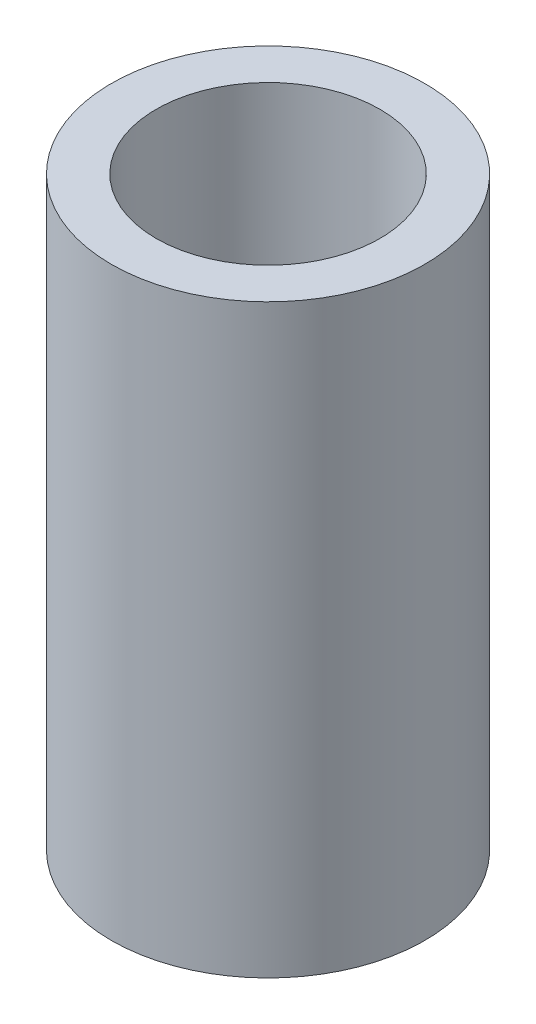
ISO-10303-21;
HEADER;
FILE_DESCRIPTION(('STEP AP214'),'2;1');
FILE_NAME('part.step','',(''),(''),'','','');
FILE_SCHEMA(('AUTOMOTIVE_DESIGN { 1 0 10303 214 1 1 1 1 }'));
ENDSEC;
DATA;
#1=APPLICATION_CONTEXT('core data for automotive mechanical design processes');
#2=APPLICATION_PROTOCOL_DEFINITION('international standard','automotive_design',2000,#1);
#3=PRODUCT_CONTEXT('',#1,'mechanical');
#4=PRODUCT('Part','Part','',(#3));
#5=PRODUCT_RELATED_PRODUCT_CATEGORY('part','',(#4));
#6=PRODUCT_DEFINITION_FORMATION('','',#4);
#7=PRODUCT_DEFINITION_CONTEXT('part definition',#1,'design');
#8=PRODUCT_DEFINITION('design','',#6,#7);
#9=PRODUCT_DEFINITION_SHAPE('','',#8);
#10=(LENGTH_UNIT() NAMED_UNIT(*) SI_UNIT(.MILLI.,.METRE.));
#11=(NAMED_UNIT(*) PLANE_ANGLE_UNIT() SI_UNIT($,.RADIAN.));
#12=(NAMED_UNIT(*) SI_UNIT($,.STERADIAN.) SOLID_ANGLE_UNIT());
#13=UNCERTAINTY_MEASURE_WITH_UNIT(LENGTH_MEASURE(1.E-05),#10,'distance_accuracy_value','');
#14=(GEOMETRIC_REPRESENTATION_CONTEXT(3) GLOBAL_UNCERTAINTY_ASSIGNED_CONTEXT((#13)) GLOBAL_UNIT_ASSIGNED_CONTEXT((#10,
#11,#12)) REPRESENTATION_CONTEXT('',''));
#15=CARTESIAN_POINT('',(0.,0.,0.));
#16=DIRECTION('',(0.,0.,1.));
#17=DIRECTION('',(1.,0.,0.));
#18=AXIS2_PLACEMENT_3D('',#15,#16,#17);
#19=CARTESIAN_POINT('',(0.,8.3058,0.));
#20=DIRECTION('',(0.,1.,0.));
#21=DIRECTION('',(0.,0.,1.));
#22=AXIS2_PLACEMENT_3D('',#19,#20,#21);
#23=PLANE('',#22);
#24=CARTESIAN_POINT('',(0.,8.3058,0.));
#25=DIRECTION('',(0.,1.,0.));
#26=DIRECTION('',(0.,0.,1.));
#27=AXIS2_PLACEMENT_3D('',#24,#25,#26);
#28=CIRCLE('',#27,2.2225);
#29=CARTESIAN_POINT('',(0.,8.3058,2.2225));
#30=VERTEX_POINT('',#29);
#31=EDGE_CURVE('E10',#30,#30,#28,.T.);
#32=ORIENTED_EDGE('',*,*,#31,.T.);
#33=EDGE_LOOP('',(#32));
#34=FACE_BOUND('',#33,.T.);
#35=CARTESIAN_POINT('',(0.,8.3058,0.));
#36=DIRECTION('',(0.,1.,0.));
#37=DIRECTION('',(0.,0.,1.));
#38=AXIS2_PLACEMENT_3D('',#35,#36,#37);
#39=CIRCLE('',#38,1.5875);
#40=CARTESIAN_POINT('',(0.,8.3058,1.5875));
#41=VERTEX_POINT('',#40);
#42=EDGE_CURVE('E41',#41,#41,#39,.T.);
#43=ORIENTED_EDGE('',*,*,#42,.F.);
#44=EDGE_LOOP('',(#43));
#45=FACE_BOUND('',#44,.T.);
#46=ADVANCED_FACE('F30',(#34,#45),#23,.T.);
#47=CARTESIAN_POINT('',(0.,0.,0.));
#48=DIRECTION('',(0.,1.,0.));
#49=DIRECTION('',(0.,0.,1.));
#50=AXIS2_PLACEMENT_3D('',#47,#48,#49);
#51=PLANE('',#50);
#52=CARTESIAN_POINT('',(0.,0.,0.));
#53=DIRECTION('',(0.,1.,0.));
#54=DIRECTION('',(0.,0.,1.));
#55=AXIS2_PLACEMENT_3D('',#52,#53,#54);
#56=CIRCLE('',#55,2.2225);
#57=CARTESIAN_POINT('',(0.,0.,2.2225));
#58=VERTEX_POINT('',#57);
#59=EDGE_CURVE('E34',#58,#58,#56,.T.);
#60=ORIENTED_EDGE('',*,*,#59,.F.);
#61=EDGE_LOOP('',(#60));
#62=FACE_BOUND('',#61,.T.);
#63=CARTESIAN_POINT('',(0.,0.,0.));
#64=DIRECTION('',(0.,1.,0.));
#65=DIRECTION('',(0.,0.,1.));
#66=AXIS2_PLACEMENT_3D('',#63,#64,#65);
#67=CIRCLE('',#66,1.5875);
#68=CARTESIAN_POINT('',(0.,0.,1.5875));
#69=VERTEX_POINT('',#68);
#70=EDGE_CURVE('E43',#69,#69,#67,.T.);
#71=ORIENTED_EDGE('',*,*,#70,.T.);
#72=EDGE_LOOP('',(#71));
#73=FACE_BOUND('',#72,.T.);
#74=ADVANCED_FACE('F53',(#62,#73),#51,.F.);
#75=CARTESIAN_POINT('',(0.,8.3058,0.));
#76=DIRECTION('',(0.,-1.,0.));
#77=DIRECTION('',(0.,0.,-1.));
#78=AXIS2_PLACEMENT_3D('',#75,#76,#77);
#79=CYLINDRICAL_SURFACE('',#78,2.2225);
#80=ORIENTED_EDGE('',*,*,#31,.F.);
#81=EDGE_LOOP('',(#80));
#82=FACE_BOUND('',#81,.T.);
#83=ORIENTED_EDGE('',*,*,#59,.T.);
#84=EDGE_LOOP('',(#83));
#85=FACE_BOUND('',#84,.T.);
#86=ADVANCED_FACE('F32',(#82,#85),#79,.T.);
#87=CARTESIAN_POINT('',(0.,8.3058,0.));
#88=DIRECTION('',(0.,-1.,0.));
#89=DIRECTION('',(0.,0.,-1.));
#90=AXIS2_PLACEMENT_3D('',#87,#88,#89);
#91=CYLINDRICAL_SURFACE('',#90,1.5875);
#92=ORIENTED_EDGE('',*,*,#42,.T.);
#93=EDGE_LOOP('',(#92));
#94=FACE_BOUND('',#93,.T.);
#95=ORIENTED_EDGE('',*,*,#70,.F.);
#96=EDGE_LOOP('',(#95));
#97=FACE_BOUND('',#96,.T.);
#98=ADVANCED_FACE('F49',(#94,#97),#91,.F.);
#99=CLOSED_SHELL('',(#46,#74,#86,#98));
#100=MANIFOLD_SOLID_BREP('B2',#99);
#101=ADVANCED_BREP_SHAPE_REPRESENTATION('',(#18,#100),#14);
#102=SHAPE_DEFINITION_REPRESENTATION(#9,#101);
ENDSEC;
END-ISO-10303-21;
